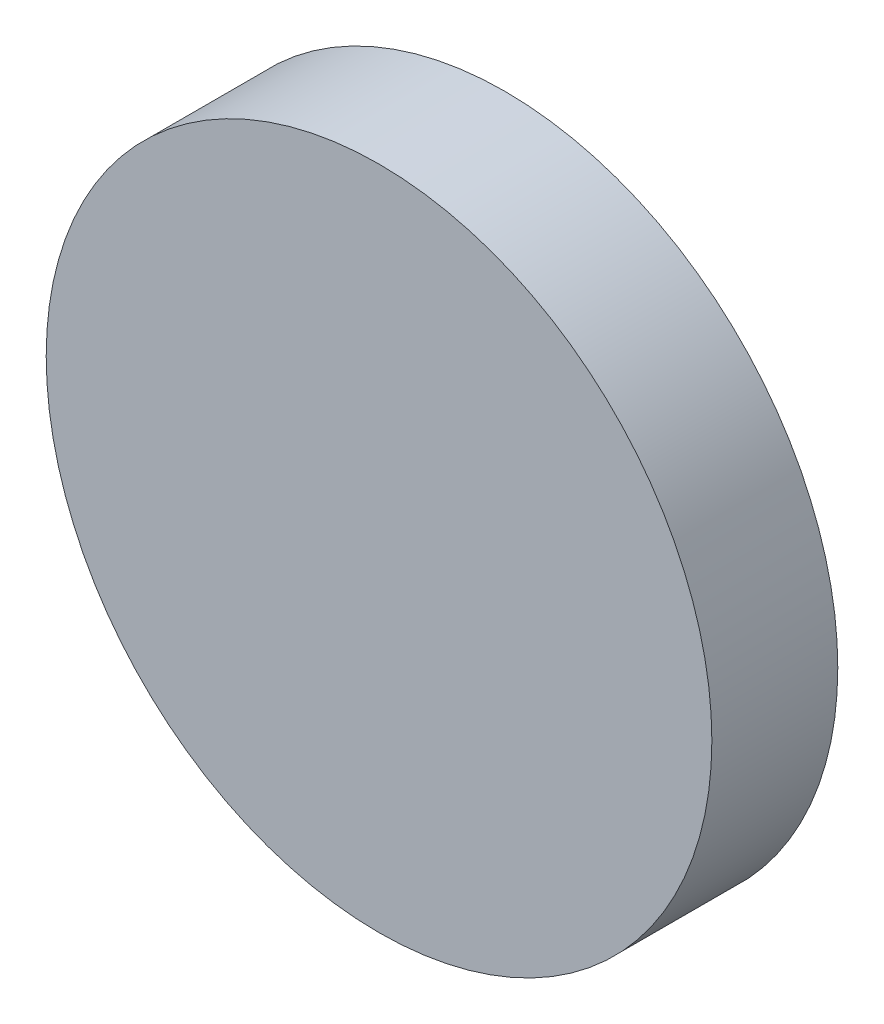
ISO-10303-21;
HEADER;
FILE_DESCRIPTION(('STEP AP214'),'2;1');
FILE_NAME('part.step','',(''),(''),'','','');
FILE_SCHEMA(('AUTOMOTIVE_DESIGN { 1 0 10303 214 1 1 1 1 }'));
ENDSEC;
DATA;
#1=APPLICATION_CONTEXT('core data for automotive mechanical design processes');
#2=APPLICATION_PROTOCOL_DEFINITION('international standard','automotive_design',2000,#1);
#3=PRODUCT_CONTEXT('',#1,'mechanical');
#4=PRODUCT('Part','Part','',(#3));
#5=PRODUCT_RELATED_PRODUCT_CATEGORY('part','',(#4));
#6=PRODUCT_DEFINITION_FORMATION('','',#4);
#7=PRODUCT_DEFINITION_CONTEXT('part definition',#1,'design');
#8=PRODUCT_DEFINITION('design','',#6,#7);
#9=PRODUCT_DEFINITION_SHAPE('','',#8);
#10=(LENGTH_UNIT() NAMED_UNIT(*) SI_UNIT(.MILLI.,.METRE.));
#11=(NAMED_UNIT(*) PLANE_ANGLE_UNIT() SI_UNIT($,.RADIAN.));
#12=(NAMED_UNIT(*) SI_UNIT($,.STERADIAN.) SOLID_ANGLE_UNIT());
#13=UNCERTAINTY_MEASURE_WITH_UNIT(LENGTH_MEASURE(1.E-05),#10,'distance_accuracy_value','');
#14=(GEOMETRIC_REPRESENTATION_CONTEXT(3) GLOBAL_UNCERTAINTY_ASSIGNED_CONTEXT((#13)) GLOBAL_UNIT_ASSIGNED_CONTEXT((#10,
#11,#12)) REPRESENTATION_CONTEXT('',''));
#15=CARTESIAN_POINT('',(0.,0.,0.));
#16=DIRECTION('',(0.,0.,1.));
#17=DIRECTION('',(1.,0.,0.));
#18=AXIS2_PLACEMENT_3D('',#15,#16,#17);
#19=CARTESIAN_POINT('',(0.,0.,2.5));
#20=DIRECTION('',(0.,0.,-1.));
#21=DIRECTION('',(-1.,0.,0.));
#22=AXIS2_PLACEMENT_3D('',#19,#20,#21);
#23=CYLINDRICAL_SURFACE('',#22,9.25);
#24=CARTESIAN_POINT('',(0.,0.,2.5));
#25=DIRECTION('',(0.,0.,1.));
#26=DIRECTION('',(1.,0.,0.));
#27=AXIS2_PLACEMENT_3D('',#24,#25,#26);
#28=CIRCLE('',#27,9.25);
#29=CARTESIAN_POINT('',(9.25,0.,2.5));
#30=VERTEX_POINT('',#29);
#31=EDGE_CURVE('E11',#30,#30,#28,.T.);
#32=ORIENTED_EDGE('',*,*,#31,.F.);
#33=EDGE_LOOP('',(#32));
#34=FACE_BOUND('',#33,.T.);
#35=CARTESIAN_POINT('',(0.,0.,-1.));
#36=DIRECTION('',(0.,0.,1.));
#37=DIRECTION('',(1.,0.,0.));
#38=AXIS2_PLACEMENT_3D('',#35,#36,#37);
#39=CIRCLE('',#38,9.25);
#40=CARTESIAN_POINT('',(9.25,0.,-1.));
#41=VERTEX_POINT('',#40);
#42=EDGE_CURVE('E117',#41,#41,#39,.T.);
#43=ORIENTED_EDGE('',*,*,#42,.T.);
#44=EDGE_LOOP('',(#43));
#45=FACE_BOUND('',#44,.T.);
#46=ADVANCED_FACE('F39',(#34,#45),#23,.T.);
#47=CARTESIAN_POINT('',(0.,0.,2.5));
#48=DIRECTION('',(0.,0.,1.));
#49=DIRECTION('',(1.,0.,0.));
#50=AXIS2_PLACEMENT_3D('',#47,#48,#49);
#51=PLANE('',#50);
#52=ORIENTED_EDGE('',*,*,#31,.T.);
#53=EDGE_LOOP('',(#52));
#54=FACE_BOUND('',#53,.T.);
#55=ADVANCED_FACE('F178',(#54),#51,.T.);
#56=CARTESIAN_POINT('',(0.,0.,-1.));
#57=DIRECTION('',(0.,0.,1.));
#58=DIRECTION('',(1.,0.,0.));
#59=AXIS2_PLACEMENT_3D('',#56,#57,#58);
#60=CYLINDRICAL_SURFACE('',#59,3.);
#61=CARTESIAN_POINT('',(0.,0.,-1.));
#62=DIRECTION('',(0.,0.,1.));
#63=DIRECTION('',(1.,0.,0.));
#64=AXIS2_PLACEMENT_3D('',#61,#62,#63);
#65=CIRCLE('',#64,3.);
#66=CARTESIAN_POINT('',(0.75,-2.90473750965556,-1.));
#67=VERTEX_POINT('',#66);
#68=CARTESIAN_POINT('',(0.75,2.90473750965556,-1.));
#69=VERTEX_POINT('',#68);
#70=EDGE_CURVE('E53',#67,#69,#65,.T.);
#71=ORIENTED_EDGE('',*,*,#70,.F.);
#72=DIRECTION('',(0.,0.,1.));
#73=VECTOR('',#72,1.);
#74=CARTESIAN_POINT('',(0.75,-2.90473750965556,-1.));
#75=LINE('',#74,#73);
#76=CARTESIAN_POINT('',(0.75,-2.90473750965556,0.));
#77=VERTEX_POINT('',#76);
#78=EDGE_CURVE('E99',#67,#77,#75,.T.);
#79=ORIENTED_EDGE('',*,*,#78,.T.);
#80=CARTESIAN_POINT('',(0.,0.,0.));
#81=DIRECTION('',(0.,0.,1.));
#82=DIRECTION('',(1.,0.,0.));
#83=AXIS2_PLACEMENT_3D('',#80,#81,#82);
#84=CIRCLE('',#83,3.);
#85=CARTESIAN_POINT('',(0.75,2.90473750965556,0.));
#86=VERTEX_POINT('',#85);
#87=EDGE_CURVE('E93',#77,#86,#84,.T.);
#88=ORIENTED_EDGE('',*,*,#87,.T.);
#89=DIRECTION('',(0.,0.,1.));
#90=VECTOR('',#89,1.);
#91=CARTESIAN_POINT('',(0.75,2.90473750965556,-5.));
#92=LINE('',#91,#90);
#93=EDGE_CURVE('E96',#69,#86,#92,.T.);
#94=ORIENTED_EDGE('',*,*,#93,.F.);
#95=EDGE_LOOP('',(#71,#79,#88,#94));
#96=FACE_BOUND('',#95,.T.);
#97=ADVANCED_FACE('F95',(#96),#60,.F.);
#98=DIRECTION('',(0.,0.,1.));
#99=VECTOR('',#98,1.);
#100=CARTESIAN_POINT('',(-0.75,-2.90473750965556,-5.));
#101=LINE('',#100,#99);
#102=CARTESIAN_POINT('',(-0.75,-2.90473750965556,-1.));
#103=VERTEX_POINT('',#102);
#104=CARTESIAN_POINT('',(-0.75,-2.90473750965556,0.));
#105=VERTEX_POINT('',#104);
#106=EDGE_CURVE('E127',#103,#105,#101,.T.);
#107=ORIENTED_EDGE('',*,*,#106,.F.);
#108=CARTESIAN_POINT('',(-0.75,2.90473750965556,-1.));
#109=VERTEX_POINT('',#108);
#110=EDGE_CURVE('E137',#109,#103,#65,.T.);
#111=ORIENTED_EDGE('',*,*,#110,.F.);
#112=DIRECTION('',(0.,0.,1.));
#113=VECTOR('',#112,1.);
#114=CARTESIAN_POINT('',(-0.75,2.90473750965556,-5.));
#115=LINE('',#114,#113);
#116=CARTESIAN_POINT('',(-0.75,2.90473750965556,0.));
#117=VERTEX_POINT('',#116);
#118=EDGE_CURVE('E130',#109,#117,#115,.T.);
#119=ORIENTED_EDGE('',*,*,#118,.T.);
#120=EDGE_CURVE('E103',#117,#105,#84,.T.);
#121=ORIENTED_EDGE('',*,*,#120,.T.);
#122=EDGE_LOOP('',(#107,#111,#119,#121));
#123=FACE_BOUND('',#122,.T.);
#124=ADVANCED_FACE('F134',(#123),#60,.F.);
#125=CARTESIAN_POINT('',(0.,0.,-1.));
#126=DIRECTION('',(0.,0.,1.));
#127=DIRECTION('',(1.,0.,0.));
#128=AXIS2_PLACEMENT_3D('',#125,#126,#127);
#129=PLANE('',#128);
#130=EDGE_CURVE('E148',#69,#109,#65,.T.);
#131=ORIENTED_EDGE('',*,*,#130,.T.);
#132=ORIENTED_EDGE('',*,*,#110,.T.);
#133=EDGE_CURVE('E147',#103,#67,#65,.T.);
#134=ORIENTED_EDGE('',*,*,#133,.T.);
#135=ORIENTED_EDGE('',*,*,#70,.T.);
#136=EDGE_LOOP('',(#131,#132,#134,#135));
#137=FACE_BOUND('',#136,.T.);
#138=ORIENTED_EDGE('',*,*,#42,.F.);
#139=EDGE_LOOP('',(#138));
#140=FACE_BOUND('',#139,.T.);
#141=ADVANCED_FACE('F145',(#137,#140),#129,.F.);
#142=CARTESIAN_POINT('',(0.,0.,-5.));
#143=DIRECTION('',(0.,0.,1.));
#144=DIRECTION('',(1.,0.,0.));
#145=AXIS2_PLACEMENT_3D('',#142,#143,#144);
#146=PLANE('',#145);
#147=DIRECTION('',(0.,-1.,0.));
#148=VECTOR('',#147,1.);
#149=CARTESIAN_POINT('',(0.75,0.,-5.));
#150=LINE('',#149,#148);
#151=CARTESIAN_POINT('',(0.75,2.90473750965556,-5.));
#152=VERTEX_POINT('',#151);
#153=CARTESIAN_POINT('',(0.75,-2.90473750965556,-5.));
#154=VERTEX_POINT('',#153);
#155=EDGE_CURVE('E61',#152,#154,#150,.T.);
#156=ORIENTED_EDGE('',*,*,#155,.T.);
#157=CARTESIAN_POINT('',(0.,0.,-5.));
#158=DIRECTION('',(0.,0.,1.));
#159=DIRECTION('',(1.,0.,0.));
#160=AXIS2_PLACEMENT_3D('',#157,#158,#159);
#161=CIRCLE('',#160,3.);
#162=CARTESIAN_POINT('',(-0.75,-2.90473750965556,-5.));
#163=VERTEX_POINT('',#162);
#164=EDGE_CURVE('E111',#163,#154,#161,.T.);
#165=ORIENTED_EDGE('',*,*,#164,.F.);
#166=DIRECTION('',(0.,-1.,0.));
#167=VECTOR('',#166,1.);
#168=CARTESIAN_POINT('',(-0.75,0.,-5.));
#169=LINE('',#168,#167);
#170=CARTESIAN_POINT('',(-0.75,2.90473750965556,-5.));
#171=VERTEX_POINT('',#170);
#172=EDGE_CURVE('E162',#171,#163,#169,.T.);
#173=ORIENTED_EDGE('',*,*,#172,.F.);
#174=CARTESIAN_POINT('',(0.,0.,-5.));
#175=DIRECTION('',(0.,0.,1.));
#176=DIRECTION('',(1.,0.,0.));
#177=AXIS2_PLACEMENT_3D('',#174,#175,#176);
#178=CIRCLE('',#177,3.);
#179=EDGE_CURVE('E160',#152,#171,#178,.T.);
#180=ORIENTED_EDGE('',*,*,#179,.F.);
#181=EDGE_LOOP('',(#156,#165,#173,#180));
#182=FACE_BOUND('',#181,.T.);
#183=ADVANCED_FACE('F164',(#182),#146,.F.);
#184=CARTESIAN_POINT('',(0.,0.,-5.));
#185=DIRECTION('',(0.,0.,1.));
#186=DIRECTION('',(1.,0.,0.));
#187=AXIS2_PLACEMENT_3D('',#184,#185,#186);
#188=CYLINDRICAL_SURFACE('',#187,3.);
#189=EDGE_CURVE('E128',#171,#109,#115,.T.);
#190=ORIENTED_EDGE('',*,*,#189,.T.);
#191=ORIENTED_EDGE('',*,*,#130,.F.);
#192=EDGE_CURVE('E110',#152,#69,#92,.T.);
#193=ORIENTED_EDGE('',*,*,#192,.F.);
#194=ORIENTED_EDGE('',*,*,#179,.T.);
#195=EDGE_LOOP('',(#190,#191,#193,#194));
#196=FACE_BOUND('',#195,.T.);
#197=ADVANCED_FACE('F166',(#196),#188,.T.);
#198=CARTESIAN_POINT('',(-0.75,0.,-5.));
#199=DIRECTION('',(-1.,0.,0.));
#200=DIRECTION('',(0.,0.,1.));
#201=AXIS2_PLACEMENT_3D('',#198,#199,#200);
#202=PLANE('',#201);
#203=CARTESIAN_POINT('',(-0.750000000000001,0.,-3.1));
#204=DIRECTION('',(-1.,0.,0.));
#205=DIRECTION('',(0.,0.,1.));
#206=AXIS2_PLACEMENT_3D('',#203,#204,#205);
#207=CIRCLE('',#206,1.25);
#208=CARTESIAN_POINT('',(-0.750000000000001,0.,-1.85));
#209=VERTEX_POINT('',#208);
#210=EDGE_CURVE('E155',#209,#209,#207,.F.);
#211=ORIENTED_EDGE('',*,*,#210,.T.);
#212=EDGE_LOOP('',(#211));
#213=FACE_BOUND('',#212,.T.);
#214=DIRECTION('',(0.,-1.,0.));
#215=VECTOR('',#214,1.);
#216=CARTESIAN_POINT('',(-0.75,0.,0.));
#217=LINE('',#216,#215);
#218=EDGE_CURVE('E113',#117,#105,#217,.T.);
#219=ORIENTED_EDGE('',*,*,#218,.F.);
#220=ORIENTED_EDGE('',*,*,#118,.F.);
#221=ORIENTED_EDGE('',*,*,#189,.F.);
#222=ORIENTED_EDGE('',*,*,#172,.T.);
#223=EDGE_CURVE('E124',#163,#103,#101,.T.);
#224=ORIENTED_EDGE('',*,*,#223,.T.);
#225=ORIENTED_EDGE('',*,*,#106,.T.);
#226=EDGE_LOOP('',(#219,#220,#221,#222,#224,#225));
#227=FACE_BOUND('',#226,.T.);
#228=ADVANCED_FACE('F142',(#213,#227),#202,.T.);
#229=CARTESIAN_POINT('',(0.,0.,-5.));
#230=DIRECTION('',(0.,0.,1.));
#231=DIRECTION('',(1.,0.,0.));
#232=AXIS2_PLACEMENT_3D('',#229,#230,#231);
#233=CYLINDRICAL_SURFACE('',#232,3.);
#234=DIRECTION('',(0.,0.,1.));
#235=VECTOR('',#234,1.);
#236=CARTESIAN_POINT('',(0.75,-2.90473750965556,-5.));
#237=LINE('',#236,#235);
#238=EDGE_CURVE('E46',#154,#67,#237,.T.);
#239=ORIENTED_EDGE('',*,*,#238,.T.);
#240=ORIENTED_EDGE('',*,*,#133,.F.);
#241=ORIENTED_EDGE('',*,*,#223,.F.);
#242=ORIENTED_EDGE('',*,*,#164,.T.);
#243=EDGE_LOOP('',(#239,#240,#241,#242));
#244=FACE_BOUND('',#243,.T.);
#245=ADVANCED_FACE('F151',(#244),#233,.T.);
#246=CARTESIAN_POINT('',(0.75,0.,-5.));
#247=DIRECTION('',(-1.,0.,0.));
#248=DIRECTION('',(0.,0.,1.));
#249=AXIS2_PLACEMENT_3D('',#246,#247,#248);
#250=PLANE('',#249);
#251=CARTESIAN_POINT('',(0.75,0.,-3.1));
#252=DIRECTION('',(1.,0.,0.));
#253=DIRECTION('',(0.,0.,-1.));
#254=AXIS2_PLACEMENT_3D('',#251,#252,#253);
#255=CIRCLE('',#254,1.25);
#256=CARTESIAN_POINT('',(0.75,0.,-4.35));
#257=VERTEX_POINT('',#256);
#258=EDGE_CURVE('E104',#257,#257,#255,.T.);
#259=ORIENTED_EDGE('',*,*,#258,.F.);
#260=EDGE_LOOP('',(#259));
#261=FACE_BOUND('',#260,.T.);
#262=DIRECTION('',(0.,-1.,0.));
#263=VECTOR('',#262,1.);
#264=CARTESIAN_POINT('',(0.75,0.,0.));
#265=LINE('',#264,#263);
#266=EDGE_CURVE('E109',#86,#77,#265,.T.);
#267=ORIENTED_EDGE('',*,*,#266,.T.);
#268=ORIENTED_EDGE('',*,*,#78,.F.);
#269=ORIENTED_EDGE('',*,*,#238,.F.);
#270=ORIENTED_EDGE('',*,*,#155,.F.);
#271=ORIENTED_EDGE('',*,*,#192,.T.);
#272=ORIENTED_EDGE('',*,*,#93,.T.);
#273=EDGE_LOOP('',(#267,#268,#269,#270,#271,#272));
#274=FACE_BOUND('',#273,.T.);
#275=ADVANCED_FACE('F108',(#261,#274),#250,.F.);
#276=CARTESIAN_POINT('',(0.,0.,0.));
#277=DIRECTION('',(0.,0.,1.));
#278=DIRECTION('',(1.,0.,0.));
#279=AXIS2_PLACEMENT_3D('',#276,#277,#278);
#280=PLANE('',#279);
#281=ORIENTED_EDGE('',*,*,#87,.F.);
#282=ORIENTED_EDGE('',*,*,#266,.F.);
#283=EDGE_LOOP('',(#281,#282));
#284=FACE_BOUND('',#283,.T.);
#285=ADVANCED_FACE('F112',(#284),#280,.F.);
#286=ORIENTED_EDGE('',*,*,#120,.F.);
#287=ORIENTED_EDGE('',*,*,#218,.T.);
#288=EDGE_LOOP('',(#286,#287));
#289=FACE_BOUND('',#288,.T.);
#290=ADVANCED_FACE('F141',(#289),#280,.F.);
#291=CARTESIAN_POINT('',(-9.251,0.,-3.1));
#292=DIRECTION('',(1.,0.,0.));
#293=DIRECTION('',(0.,0.,-1.));
#294=AXIS2_PLACEMENT_3D('',#291,#292,#293);
#295=CYLINDRICAL_SURFACE('',#294,1.25);
#296=ORIENTED_EDGE('',*,*,#210,.F.);
#297=EDGE_LOOP('',(#296));
#298=FACE_BOUND('',#297,.T.);
#299=ORIENTED_EDGE('',*,*,#258,.T.);
#300=EDGE_LOOP('',(#299));
#301=FACE_BOUND('',#300,.T.);
#302=ADVANCED_FACE('F195',(#298,#301),#295,.F.);
#303=CLOSED_SHELL('',(#46,#55,#97,#124,#141,#183,#197,#228,#245,#275,#285,#290,#302));
#304=MANIFOLD_SOLID_BREP('B2',#303);
#305=ADVANCED_BREP_SHAPE_REPRESENTATION('',(#18,#304),#14);
#306=SHAPE_DEFINITION_REPRESENTATION(#9,#305);
ENDSEC;
END-ISO-10303-21;
